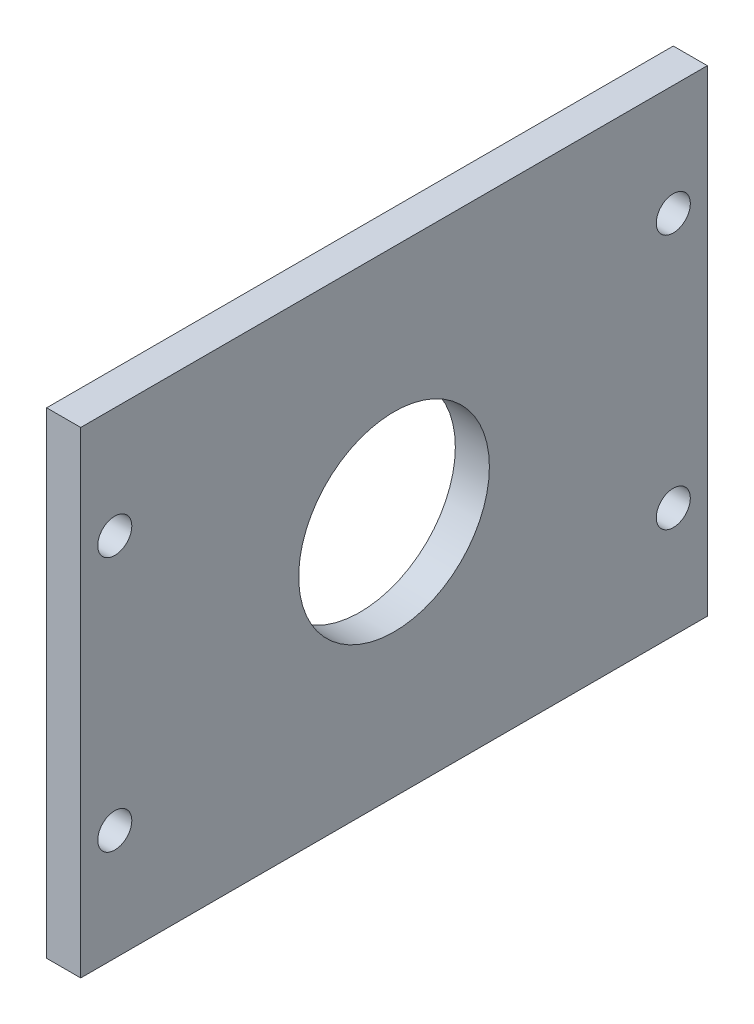
ISO-10303-21;
HEADER;
FILE_DESCRIPTION(('STEP AP214'),'2;1');
FILE_NAME('part.step','',(''),(''),'','','');
FILE_SCHEMA(('AUTOMOTIVE_DESIGN { 1 0 10303 214 1 1 1 1 }'));
ENDSEC;
DATA;
#1=APPLICATION_CONTEXT('core data for automotive mechanical design processes');
#2=APPLICATION_PROTOCOL_DEFINITION('international standard','automotive_design',2000,#1);
#3=PRODUCT_CONTEXT('',#1,'mechanical');
#4=PRODUCT('Part','Part','',(#3));
#5=PRODUCT_RELATED_PRODUCT_CATEGORY('part','',(#4));
#6=PRODUCT_DEFINITION_FORMATION('','',#4);
#7=PRODUCT_DEFINITION_CONTEXT('part definition',#1,'design');
#8=PRODUCT_DEFINITION('design','',#6,#7);
#9=PRODUCT_DEFINITION_SHAPE('','',#8);
#10=(LENGTH_UNIT() NAMED_UNIT(*) SI_UNIT(.MILLI.,.METRE.));
#11=(NAMED_UNIT(*) PLANE_ANGLE_UNIT() SI_UNIT($,.RADIAN.));
#12=(NAMED_UNIT(*) SI_UNIT($,.STERADIAN.) SOLID_ANGLE_UNIT());
#13=UNCERTAINTY_MEASURE_WITH_UNIT(LENGTH_MEASURE(1.E-05),#10,'distance_accuracy_value','');
#14=(GEOMETRIC_REPRESENTATION_CONTEXT(3) GLOBAL_UNCERTAINTY_ASSIGNED_CONTEXT((#13)) GLOBAL_UNIT_ASSIGNED_CONTEXT((#10,
#11,#12)) REPRESENTATION_CONTEXT('',''));
#15=CARTESIAN_POINT('',(0.,0.,0.));
#16=DIRECTION('',(0.,0.,1.));
#17=DIRECTION('',(1.,0.,0.));
#18=AXIS2_PLACEMENT_3D('',#15,#16,#17);
#19=CARTESIAN_POINT('',(5.,0.,0.));
#20=DIRECTION('',(1.,0.,0.));
#21=DIRECTION('',(0.,0.,-1.));
#22=AXIS2_PLACEMENT_3D('',#19,#20,#21);
#23=PLANE('',#22);
#24=CARTESIAN_POINT('',(5.,-53.7275541413606,-5.));
#25=DIRECTION('',(1.,0.,0.));
#26=DIRECTION('',(0.,0.,-1.));
#27=AXIS2_PLACEMENT_3D('',#24,#25,#26);
#28=CIRCLE('',#27,2.5);
#29=CARTESIAN_POINT('',(5.,-53.7275541413606,-7.5));
#30=VERTEX_POINT('',#29);
#31=EDGE_CURVE('E123',#30,#30,#28,.T.);
#32=ORIENTED_EDGE('',*,*,#31,.F.);
#33=EDGE_LOOP('',(#32));
#34=FACE_BOUND('',#33,.T.);
#35=CARTESIAN_POINT('',(5.,-53.7275541413606,-87.));
#36=DIRECTION('',(1.,0.,0.));
#37=DIRECTION('',(0.,0.,-1.));
#38=AXIS2_PLACEMENT_3D('',#35,#36,#37);
#39=CIRCLE('',#38,2.5);
#40=CARTESIAN_POINT('',(5.,-53.7275541413606,-89.5));
#41=VERTEX_POINT('',#40);
#42=EDGE_CURVE('E126',#41,#41,#39,.T.);
#43=ORIENTED_EDGE('',*,*,#42,.F.);
#44=EDGE_LOOP('',(#43));
#45=FACE_BOUND('',#44,.T.);
#46=CARTESIAN_POINT('',(5.,-16.2724458586394,-87.));
#47=DIRECTION('',(1.,0.,0.));
#48=DIRECTION('',(0.,0.,-1.));
#49=AXIS2_PLACEMENT_3D('',#46,#47,#48);
#50=CIRCLE('',#49,2.5);
#51=CARTESIAN_POINT('',(5.,-16.2724458586394,-89.5));
#52=VERTEX_POINT('',#51);
#53=EDGE_CURVE('E129',#52,#52,#50,.T.);
#54=ORIENTED_EDGE('',*,*,#53,.F.);
#55=EDGE_LOOP('',(#54));
#56=FACE_BOUND('',#55,.T.);
#57=CARTESIAN_POINT('',(5.,-16.2724458586394,-5.));
#58=DIRECTION('',(1.,0.,0.));
#59=DIRECTION('',(0.,0.,-1.));
#60=AXIS2_PLACEMENT_3D('',#57,#58,#59);
#61=CIRCLE('',#60,2.5);
#62=CARTESIAN_POINT('',(5.,-16.2724458586394,-7.5));
#63=VERTEX_POINT('',#62);
#64=EDGE_CURVE('E115',#63,#63,#61,.T.);
#65=ORIENTED_EDGE('',*,*,#64,.F.);
#66=EDGE_LOOP('',(#65));
#67=FACE_BOUND('',#66,.T.);
#68=DIRECTION('',(0.,-1.,0.));
#69=VECTOR('',#68,1.);
#70=CARTESIAN_POINT('',(5.,0.,0.));
#71=LINE('',#70,#69);
#72=CARTESIAN_POINT('',(5.,0.,0.));
#73=VERTEX_POINT('',#72);
#74=CARTESIAN_POINT('',(5.,-70.,0.));
#75=VERTEX_POINT('',#74);
#76=EDGE_CURVE('E85',#73,#75,#71,.T.);
#77=ORIENTED_EDGE('',*,*,#76,.T.);
#78=DIRECTION('',(0.,0.,-1.));
#79=VECTOR('',#78,1.);
#80=CARTESIAN_POINT('',(5.,-70.,0.));
#81=LINE('',#80,#79);
#82=CARTESIAN_POINT('',(5.,-70.,-92.));
#83=VERTEX_POINT('',#82);
#84=EDGE_CURVE('E80',#75,#83,#81,.T.);
#85=ORIENTED_EDGE('',*,*,#84,.T.);
#86=DIRECTION('',(0.,1.,0.));
#87=VECTOR('',#86,1.);
#88=CARTESIAN_POINT('',(5.,0.,-92.));
#89=LINE('',#88,#87);
#90=CARTESIAN_POINT('',(5.,0.,-92.));
#91=VERTEX_POINT('',#90);
#92=EDGE_CURVE('E83',#83,#91,#89,.T.);
#93=ORIENTED_EDGE('',*,*,#92,.T.);
#94=DIRECTION('',(0.,0.,1.));
#95=VECTOR('',#94,1.);
#96=CARTESIAN_POINT('',(5.,0.,0.));
#97=LINE('',#96,#95);
#98=EDGE_CURVE('E50',#91,#73,#97,.T.);
#99=ORIENTED_EDGE('',*,*,#98,.T.);
#100=EDGE_LOOP('',(#77,#85,#93,#99));
#101=FACE_BOUND('',#100,.T.);
#102=CARTESIAN_POINT('',(5.,-35.,-46.));
#103=DIRECTION('',(1.,0.,0.));
#104=DIRECTION('',(0.,0.,-1.));
#105=AXIS2_PLACEMENT_3D('',#102,#103,#104);
#106=CIRCLE('',#105,14.);
#107=CARTESIAN_POINT('',(5.,-35.,-60.));
#108=VERTEX_POINT('',#107);
#109=EDGE_CURVE('E100',#108,#108,#106,.T.);
#110=ORIENTED_EDGE('',*,*,#109,.F.);
#111=EDGE_LOOP('',(#110));
#112=FACE_BOUND('',#111,.T.);
#113=ADVANCED_FACE('F33',(#34,#45,#56,#67,#101,#112),#23,.T.);
#114=CARTESIAN_POINT('',(0.,0.,0.));
#115=DIRECTION('',(1.,0.,0.));
#116=DIRECTION('',(0.,0.,-1.));
#117=AXIS2_PLACEMENT_3D('',#114,#115,#116);
#118=PLANE('',#117);
#119=CARTESIAN_POINT('',(0.,-53.7275541413606,-5.));
#120=DIRECTION('',(1.,0.,0.));
#121=DIRECTION('',(0.,0.,1.));
#122=AXIS2_PLACEMENT_3D('',#119,#120,#121);
#123=CIRCLE('',#122,2.5);
#124=CARTESIAN_POINT('',(0.,-53.7275541413606,-2.5));
#125=VERTEX_POINT('',#124);
#126=EDGE_CURVE('E132',#125,#125,#123,.T.);
#127=ORIENTED_EDGE('',*,*,#126,.T.);
#128=EDGE_LOOP('',(#127));
#129=FACE_BOUND('',#128,.T.);
#130=CARTESIAN_POINT('',(0.,-53.7275541413606,-87.));
#131=DIRECTION('',(1.,0.,0.));
#132=DIRECTION('',(0.,0.,-1.));
#133=AXIS2_PLACEMENT_3D('',#130,#131,#132);
#134=CIRCLE('',#133,2.5);
#135=CARTESIAN_POINT('',(0.,-53.7275541413606,-89.5));
#136=VERTEX_POINT('',#135);
#137=EDGE_CURVE('E136',#136,#136,#134,.T.);
#138=ORIENTED_EDGE('',*,*,#137,.T.);
#139=EDGE_LOOP('',(#138));
#140=FACE_BOUND('',#139,.T.);
#141=CARTESIAN_POINT('',(0.,-16.2724458586394,-87.));
#142=DIRECTION('',(1.,0.,0.));
#143=DIRECTION('',(0.,0.,1.));
#144=AXIS2_PLACEMENT_3D('',#141,#142,#143);
#145=CIRCLE('',#144,2.5);
#146=CARTESIAN_POINT('',(0.,-16.2724458586394,-84.5));
#147=VERTEX_POINT('',#146);
#148=EDGE_CURVE('E133',#147,#147,#145,.T.);
#149=ORIENTED_EDGE('',*,*,#148,.T.);
#150=EDGE_LOOP('',(#149));
#151=FACE_BOUND('',#150,.T.);
#152=CARTESIAN_POINT('',(0.,-16.2724458586394,-5.));
#153=DIRECTION('',(1.,0.,0.));
#154=DIRECTION('',(0.,0.,-1.));
#155=AXIS2_PLACEMENT_3D('',#152,#153,#154);
#156=CIRCLE('',#155,2.5);
#157=CARTESIAN_POINT('',(0.,-16.2724458586394,-7.5));
#158=VERTEX_POINT('',#157);
#159=EDGE_CURVE('E120',#158,#158,#156,.T.);
#160=ORIENTED_EDGE('',*,*,#159,.T.);
#161=EDGE_LOOP('',(#160));
#162=FACE_BOUND('',#161,.T.);
#163=DIRECTION('',(0.,-1.,0.));
#164=VECTOR('',#163,1.);
#165=CARTESIAN_POINT('',(0.,0.,0.));
#166=LINE('',#165,#164);
#167=CARTESIAN_POINT('',(0.,0.,0.));
#168=VERTEX_POINT('',#167);
#169=CARTESIAN_POINT('',(0.,-70.,0.));
#170=VERTEX_POINT('',#169);
#171=EDGE_CURVE('E97',#168,#170,#166,.T.);
#172=ORIENTED_EDGE('',*,*,#171,.F.);
#173=DIRECTION('',(0.,0.,1.));
#174=VECTOR('',#173,1.);
#175=CARTESIAN_POINT('',(0.,0.,0.));
#176=LINE('',#175,#174);
#177=CARTESIAN_POINT('',(0.,0.,-92.));
#178=VERTEX_POINT('',#177);
#179=EDGE_CURVE('E73',#178,#168,#176,.T.);
#180=ORIENTED_EDGE('',*,*,#179,.F.);
#181=DIRECTION('',(0.,1.,0.));
#182=VECTOR('',#181,1.);
#183=CARTESIAN_POINT('',(0.,0.,-92.));
#184=LINE('',#183,#182);
#185=CARTESIAN_POINT('',(0.,-70.,-92.));
#186=VERTEX_POINT('',#185);
#187=EDGE_CURVE('E67',#186,#178,#184,.T.);
#188=ORIENTED_EDGE('',*,*,#187,.F.);
#189=DIRECTION('',(0.,0.,-1.));
#190=VECTOR('',#189,1.);
#191=CARTESIAN_POINT('',(0.,-70.,0.));
#192=LINE('',#191,#190);
#193=EDGE_CURVE('E89',#170,#186,#192,.T.);
#194=ORIENTED_EDGE('',*,*,#193,.F.);
#195=EDGE_LOOP('',(#172,#180,#188,#194));
#196=FACE_BOUND('',#195,.T.);
#197=CARTESIAN_POINT('',(0.,-35.,-46.));
#198=DIRECTION('',(1.,0.,0.));
#199=DIRECTION('',(0.,0.,-1.));
#200=AXIS2_PLACEMENT_3D('',#197,#198,#199);
#201=CIRCLE('',#200,14.);
#202=CARTESIAN_POINT('',(0.,-35.,-60.));
#203=VERTEX_POINT('',#202);
#204=EDGE_CURVE('E112',#203,#203,#201,.T.);
#205=ORIENTED_EDGE('',*,*,#204,.T.);
#206=EDGE_LOOP('',(#205));
#207=FACE_BOUND('',#206,.T.);
#208=ADVANCED_FACE('F108',(#129,#140,#151,#162,#196,#207),#118,.F.);
#209=CARTESIAN_POINT('',(5.,0.,0.));
#210=DIRECTION('',(0.,0.,-1.));
#211=DIRECTION('',(0.,1.,0.));
#212=AXIS2_PLACEMENT_3D('',#209,#210,#211);
#213=PLANE('',#212);
#214=ORIENTED_EDGE('',*,*,#171,.T.);
#215=DIRECTION('',(-1.,0.,0.));
#216=VECTOR('',#215,1.);
#217=CARTESIAN_POINT('',(5.,-70.,0.));
#218=LINE('',#217,#216);
#219=EDGE_CURVE('E11',#75,#170,#218,.T.);
#220=ORIENTED_EDGE('',*,*,#219,.F.);
#221=ORIENTED_EDGE('',*,*,#76,.F.);
#222=DIRECTION('',(-1.,0.,0.));
#223=VECTOR('',#222,1.);
#224=CARTESIAN_POINT('',(5.,0.,0.));
#225=LINE('',#224,#223);
#226=EDGE_CURVE('E93',#73,#168,#225,.T.);
#227=ORIENTED_EDGE('',*,*,#226,.T.);
#228=EDGE_LOOP('',(#214,#220,#221,#227));
#229=FACE_BOUND('',#228,.T.);
#230=ADVANCED_FACE('F35',(#229),#213,.F.);
#231=CARTESIAN_POINT('',(5.,-70.,0.));
#232=DIRECTION('',(0.,1.,0.));
#233=DIRECTION('',(0.,0.,1.));
#234=AXIS2_PLACEMENT_3D('',#231,#232,#233);
#235=PLANE('',#234);
#236=ORIENTED_EDGE('',*,*,#193,.T.);
#237=DIRECTION('',(-1.,0.,0.));
#238=VECTOR('',#237,1.);
#239=CARTESIAN_POINT('',(5.,-70.,-92.));
#240=LINE('',#239,#238);
#241=EDGE_CURVE('E42',#83,#186,#240,.T.);
#242=ORIENTED_EDGE('',*,*,#241,.F.);
#243=ORIENTED_EDGE('',*,*,#84,.F.);
#244=ORIENTED_EDGE('',*,*,#219,.T.);
#245=EDGE_LOOP('',(#236,#242,#243,#244));
#246=FACE_BOUND('',#245,.T.);
#247=ADVANCED_FACE('F88',(#246),#235,.F.);
#248=CARTESIAN_POINT('',(5.,0.,-92.));
#249=DIRECTION('',(0.,0.,1.));
#250=DIRECTION('',(0.,-1.,0.));
#251=AXIS2_PLACEMENT_3D('',#248,#249,#250);
#252=PLANE('',#251);
#253=ORIENTED_EDGE('',*,*,#187,.T.);
#254=DIRECTION('',(-1.,0.,0.));
#255=VECTOR('',#254,1.);
#256=CARTESIAN_POINT('',(5.,0.,-92.));
#257=LINE('',#256,#255);
#258=EDGE_CURVE('E90',#91,#178,#257,.T.);
#259=ORIENTED_EDGE('',*,*,#258,.F.);
#260=ORIENTED_EDGE('',*,*,#92,.F.);
#261=ORIENTED_EDGE('',*,*,#241,.T.);
#262=EDGE_LOOP('',(#253,#259,#260,#261));
#263=FACE_BOUND('',#262,.T.);
#264=ADVANCED_FACE('F91',(#263),#252,.F.);
#265=CARTESIAN_POINT('',(5.,0.,0.));
#266=DIRECTION('',(0.,-1.,0.));
#267=DIRECTION('',(0.,0.,-1.));
#268=AXIS2_PLACEMENT_3D('',#265,#266,#267);
#269=PLANE('',#268);
#270=ORIENTED_EDGE('',*,*,#179,.T.);
#271=ORIENTED_EDGE('',*,*,#226,.F.);
#272=ORIENTED_EDGE('',*,*,#98,.F.);
#273=ORIENTED_EDGE('',*,*,#258,.T.);
#274=EDGE_LOOP('',(#270,#271,#272,#273));
#275=FACE_BOUND('',#274,.T.);
#276=ADVANCED_FACE('F105',(#275),#269,.F.);
#277=CARTESIAN_POINT('',(5.,-35.,-46.));
#278=DIRECTION('',(-1.,0.,0.));
#279=DIRECTION('',(0.,0.,1.));
#280=AXIS2_PLACEMENT_3D('',#277,#278,#279);
#281=CYLINDRICAL_SURFACE('',#280,14.);
#282=ORIENTED_EDGE('',*,*,#109,.T.);
#283=EDGE_LOOP('',(#282));
#284=FACE_BOUND('',#283,.T.);
#285=ORIENTED_EDGE('',*,*,#204,.F.);
#286=EDGE_LOOP('',(#285));
#287=FACE_BOUND('',#286,.T.);
#288=ADVANCED_FACE('F166',(#284,#287),#281,.F.);
#289=CARTESIAN_POINT('',(0.,-16.2724458586394,-5.));
#290=DIRECTION('',(1.,0.,0.));
#291=DIRECTION('',(0.,0.,-1.));
#292=AXIS2_PLACEMENT_3D('',#289,#290,#291);
#293=CYLINDRICAL_SURFACE('',#292,2.5);
#294=ORIENTED_EDGE('',*,*,#64,.T.);
#295=EDGE_LOOP('',(#294));
#296=FACE_BOUND('',#295,.T.);
#297=ORIENTED_EDGE('',*,*,#159,.F.);
#298=EDGE_LOOP('',(#297));
#299=FACE_BOUND('',#298,.T.);
#300=ADVANCED_FACE('F191',(#296,#299),#293,.F.);
#301=CARTESIAN_POINT('',(0.,-16.2724458586394,-87.));
#302=DIRECTION('',(1.,0.,0.));
#303=DIRECTION('',(0.,0.,-1.));
#304=AXIS2_PLACEMENT_3D('',#301,#302,#303);
#305=CYLINDRICAL_SURFACE('',#304,2.5);
#306=ORIENTED_EDGE('',*,*,#53,.T.);
#307=EDGE_LOOP('',(#306));
#308=FACE_BOUND('',#307,.T.);
#309=ORIENTED_EDGE('',*,*,#148,.F.);
#310=EDGE_LOOP('',(#309));
#311=FACE_BOUND('',#310,.T.);
#312=ADVANCED_FACE('F152',(#308,#311),#305,.F.);
#313=CARTESIAN_POINT('',(0.,-53.7275541413606,-87.));
#314=DIRECTION('',(1.,0.,0.));
#315=DIRECTION('',(0.,0.,-1.));
#316=AXIS2_PLACEMENT_3D('',#313,#314,#315);
#317=CYLINDRICAL_SURFACE('',#316,2.5);
#318=ORIENTED_EDGE('',*,*,#42,.T.);
#319=EDGE_LOOP('',(#318));
#320=FACE_BOUND('',#319,.T.);
#321=ORIENTED_EDGE('',*,*,#137,.F.);
#322=EDGE_LOOP('',(#321));
#323=FACE_BOUND('',#322,.T.);
#324=ADVANCED_FACE('F146',(#320,#323),#317,.F.);
#325=CARTESIAN_POINT('',(0.,-53.7275541413606,-5.));
#326=DIRECTION('',(1.,0.,0.));
#327=DIRECTION('',(0.,0.,-1.));
#328=AXIS2_PLACEMENT_3D('',#325,#326,#327);
#329=CYLINDRICAL_SURFACE('',#328,2.5);
#330=ORIENTED_EDGE('',*,*,#31,.T.);
#331=EDGE_LOOP('',(#330));
#332=FACE_BOUND('',#331,.T.);
#333=ORIENTED_EDGE('',*,*,#126,.F.);
#334=EDGE_LOOP('',(#333));
#335=FACE_BOUND('',#334,.T.);
#336=ADVANCED_FACE('F144',(#332,#335),#329,.F.);
#337=CLOSED_SHELL('',(#113,#208,#230,#247,#264,#276,#288,#300,#312,#324,#336));
#338=MANIFOLD_SOLID_BREP('B2',#337);
#339=ADVANCED_BREP_SHAPE_REPRESENTATION('',(#18,#338),#14);
#340=SHAPE_DEFINITION_REPRESENTATION(#9,#339);
ENDSEC;
END-ISO-10303-21;
